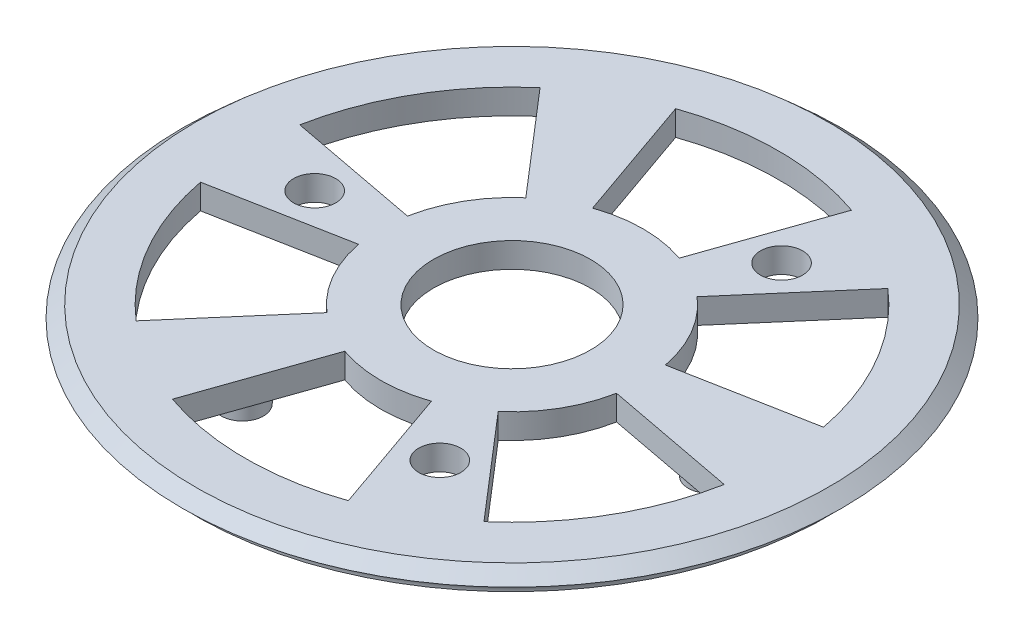
ISO-10303-21;
HEADER;
FILE_DESCRIPTION(('STEP AP214'),'2;1');
FILE_NAME('part.step','',(''),(''),'','','');
FILE_SCHEMA(('AUTOMOTIVE_DESIGN { 1 0 10303 214 1 1 1 1 }'));
ENDSEC;
DATA;
#1=APPLICATION_CONTEXT('core data for automotive mechanical design processes');
#2=APPLICATION_PROTOCOL_DEFINITION('international standard','automotive_design',2000,#1);
#3=PRODUCT_CONTEXT('',#1,'mechanical');
#4=PRODUCT('Part','Part','',(#3));
#5=PRODUCT_RELATED_PRODUCT_CATEGORY('part','',(#4));
#6=PRODUCT_DEFINITION_FORMATION('','',#4);
#7=PRODUCT_DEFINITION_CONTEXT('part definition',#1,'design');
#8=PRODUCT_DEFINITION('design','',#6,#7);
#9=PRODUCT_DEFINITION_SHAPE('','',#8);
#10=(LENGTH_UNIT() NAMED_UNIT(*) SI_UNIT(.MILLI.,.METRE.));
#11=(NAMED_UNIT(*) PLANE_ANGLE_UNIT() SI_UNIT($,.RADIAN.));
#12=(NAMED_UNIT(*) SI_UNIT($,.STERADIAN.) SOLID_ANGLE_UNIT());
#13=UNCERTAINTY_MEASURE_WITH_UNIT(LENGTH_MEASURE(1.E-05),#10,'distance_accuracy_value','');
#14=(GEOMETRIC_REPRESENTATION_CONTEXT(3) GLOBAL_UNCERTAINTY_ASSIGNED_CONTEXT((#13)) GLOBAL_UNIT_ASSIGNED_CONTEXT((#10,
#11,#12)) REPRESENTATION_CONTEXT('',''));
#15=CARTESIAN_POINT('',(0.,0.,0.));
#16=DIRECTION('',(0.,0.,1.));
#17=DIRECTION('',(1.,0.,0.));
#18=AXIS2_PLACEMENT_3D('',#15,#16,#17);
#19=CARTESIAN_POINT('',(-35.1,18.9164792308295,0.));
#20=DIRECTION('',(0.,1.,0.));
#21=DIRECTION('',(-1.,0.,0.));
#22=AXIS2_PLACEMENT_3D('',#19,#20,#21);
#23=CYLINDRICAL_SURFACE('',#22,32.1);
#24=DIRECTION('',(0.,1.,0.));
#25=VECTOR('',#24,1.);
#26=CARTESIAN_POINT('',(-66.6384220526739,-88.2865653815752,5.97812131253724));
#27=LINE('',#26,#25);
#28=CARTESIAN_POINT('',(-66.6384220526739,0.,5.97812131253724));
#29=VERTEX_POINT('',#28);
#30=CARTESIAN_POINT('',(-66.6384220526739,2.99999999999999,5.97812131253724));
#31=VERTEX_POINT('',#30);
#32=EDGE_CURVE('E210',#29,#31,#27,.T.);
#33=ORIENTED_EDGE('',*,*,#32,.T.);
#34=CARTESIAN_POINT('',(-35.1,2.99999999999999,0.));
#35=DIRECTION('',(0.,1.,0.));
#36=DIRECTION('',(-1.,0.,0.));
#37=AXIS2_PLACEMENT_3D('',#34,#35,#36);
#38=CIRCLE('',#37,32.1);
#39=CARTESIAN_POINT('',(-56.0464159498979,2.99999999999999,24.3240140366237));
#40=VERTEX_POINT('',#39);
#41=EDGE_CURVE('E226',#31,#40,#38,.T.);
#42=ORIENTED_EDGE('',*,*,#41,.T.);
#43=DIRECTION('',(0.,1.,0.));
#44=VECTOR('',#43,1.);
#45=CARTESIAN_POINT('',(-56.0464159498979,-88.2865653815752,24.3240140366237));
#46=LINE('',#45,#44);
#47=CARTESIAN_POINT('',(-56.0464159498979,0.,24.3240140366237));
#48=VERTEX_POINT('',#47);
#49=EDGE_CURVE('E289',#48,#40,#46,.T.);
#50=ORIENTED_EDGE('',*,*,#49,.F.);
#51=CARTESIAN_POINT('',(-35.1,0.,0.));
#52=DIRECTION('',(0.,1.,0.));
#53=DIRECTION('',(-1.,0.,0.));
#54=AXIS2_PLACEMENT_3D('',#51,#52,#53);
#55=CIRCLE('',#54,32.1);
#56=EDGE_CURVE('E228',#29,#48,#55,.T.);
#57=ORIENTED_EDGE('',*,*,#56,.F.);
#58=EDGE_LOOP('',(#33,#42,#50,#57));
#59=FACE_BOUND('',#58,.T.);
#60=ADVANCED_FACE('F41',(#59),#23,.F.);
#61=DIRECTION('',(0.,1.,0.));
#62=VECTOR('',#61,1.);
#63=CARTESIAN_POINT('',(-45.6920061027745,-88.2865653815752,30.3021353491596));
#64=LINE('',#63,#62);
#65=CARTESIAN_POINT('',(-45.6920061027745,0.,30.3021353491596));
#66=VERTEX_POINT('',#65);
#67=CARTESIAN_POINT('',(-45.6920061027745,2.99999999999999,30.3021353491596));
#68=VERTEX_POINT('',#67);
#69=EDGE_CURVE('E292',#66,#68,#64,.T.);
#70=ORIENTED_EDGE('',*,*,#69,.T.);
#71=CARTESIAN_POINT('',(-24.5079938972236,3.,30.3021353491588));
#72=VERTEX_POINT('',#71);
#73=EDGE_CURVE('E238',#68,#72,#38,.T.);
#74=ORIENTED_EDGE('',*,*,#73,.T.);
#75=DIRECTION('',(0.,1.,0.));
#76=VECTOR('',#75,1.);
#77=CARTESIAN_POINT('',(-24.5079938972236,-88.2865653815752,30.3021353491588));
#78=LINE('',#77,#76);
#79=CARTESIAN_POINT('',(-24.5079938972236,0.,30.3021353491588));
#80=VERTEX_POINT('',#79);
#81=EDGE_CURVE('E302',#80,#72,#78,.T.);
#82=ORIENTED_EDGE('',*,*,#81,.F.);
#83=EDGE_CURVE('E258',#66,#80,#55,.T.);
#84=ORIENTED_EDGE('',*,*,#83,.F.);
#85=EDGE_LOOP('',(#70,#74,#82,#84));
#86=FACE_BOUND('',#85,.T.);
#87=ADVANCED_FACE('F551',(#86),#23,.F.);
#88=DIRECTION('',(0.,1.,0.));
#89=VECTOR('',#88,1.);
#90=CARTESIAN_POINT('',(-14.1535840501007,-88.2865653815752,24.3240140366222));
#91=LINE('',#90,#89);
#92=CARTESIAN_POINT('',(-14.1535840501006,0.,24.3240140366223));
#93=VERTEX_POINT('',#92);
#94=CARTESIAN_POINT('',(-14.1535840501007,3.,24.3240140366222));
#95=VERTEX_POINT('',#94);
#96=EDGE_CURVE('E305',#93,#95,#91,.T.);
#97=ORIENTED_EDGE('',*,*,#96,.T.);
#98=CARTESIAN_POINT('',(-3.56157794732571,3.,5.97812131253529));
#99=VERTEX_POINT('',#98);
#100=EDGE_CURVE('E246',#95,#99,#38,.T.);
#101=ORIENTED_EDGE('',*,*,#100,.T.);
#102=DIRECTION('',(0.,1.,0.));
#103=VECTOR('',#102,1.);
#104=CARTESIAN_POINT('',(-3.56157794732569,-88.2865653815752,5.97812131253529));
#105=LINE('',#104,#103);
#106=CARTESIAN_POINT('',(-3.56157794732569,0.,5.9781213125353));
#107=VERTEX_POINT('',#106);
#108=EDGE_CURVE('E315',#107,#99,#105,.T.);
#109=ORIENTED_EDGE('',*,*,#108,.F.);
#110=EDGE_CURVE('E263',#93,#107,#55,.T.);
#111=ORIENTED_EDGE('',*,*,#110,.F.);
#112=EDGE_LOOP('',(#97,#101,#109,#111));
#113=FACE_BOUND('',#112,.T.);
#114=ADVANCED_FACE('F555',(#113),#23,.F.);
#115=DIRECTION('',(0.,1.,0.));
#116=VECTOR('',#115,1.);
#117=CARTESIAN_POINT('',(-3.56157794732606,-88.2865653815752,-5.97812131253724));
#118=LINE('',#117,#116);
#119=CARTESIAN_POINT('',(-3.56157794732609,0.,-5.97812131253724));
#120=VERTEX_POINT('',#119);
#121=CARTESIAN_POINT('',(-3.56157794732608,3.,-5.97812131253724));
#122=VERTEX_POINT('',#121);
#123=EDGE_CURVE('E318',#120,#122,#118,.T.);
#124=ORIENTED_EDGE('',*,*,#123,.T.);
#125=CARTESIAN_POINT('',(-14.1535840501021,3.,-24.3240140366236));
#126=VERTEX_POINT('',#125);
#127=EDGE_CURVE('E257',#122,#126,#38,.T.);
#128=ORIENTED_EDGE('',*,*,#127,.T.);
#129=DIRECTION('',(0.,1.,0.));
#130=VECTOR('',#129,1.);
#131=CARTESIAN_POINT('',(-14.1535840501021,-88.2865653815752,-24.3240140366236));
#132=LINE('',#131,#130);
#133=CARTESIAN_POINT('',(-14.1535840501021,0.,-24.3240140366236));
#134=VERTEX_POINT('',#133);
#135=EDGE_CURVE('E328',#134,#126,#132,.T.);
#136=ORIENTED_EDGE('',*,*,#135,.F.);
#137=EDGE_CURVE('E274',#120,#134,#55,.T.);
#138=ORIENTED_EDGE('',*,*,#137,.F.);
#139=EDGE_LOOP('',(#124,#128,#136,#138));
#140=FACE_BOUND('',#139,.T.);
#141=ADVANCED_FACE('F547',(#140),#23,.F.);
#142=DIRECTION('',(0.,1.,0.));
#143=VECTOR('',#142,1.);
#144=CARTESIAN_POINT('',(-24.5079938972254,-88.2865653815752,-30.3021353491596));
#145=LINE('',#144,#143);
#146=CARTESIAN_POINT('',(-24.5079938972255,0.,-30.3021353491596));
#147=VERTEX_POINT('',#146);
#148=CARTESIAN_POINT('',(-24.5079938972255,3.,-30.3021353491596));
#149=VERTEX_POINT('',#148);
#150=EDGE_CURVE('E67',#147,#149,#145,.T.);
#151=ORIENTED_EDGE('',*,*,#150,.T.);
#152=CARTESIAN_POINT('',(-45.6920061027764,2.99999999999999,-30.3021353491589));
#153=VERTEX_POINT('',#152);
#154=EDGE_CURVE('E250',#149,#153,#38,.T.);
#155=ORIENTED_EDGE('',*,*,#154,.T.);
#156=DIRECTION('',(0.,1.,0.));
#157=VECTOR('',#156,1.);
#158=CARTESIAN_POINT('',(-45.6920061027764,-88.2865653815752,-30.3021353491589));
#159=LINE('',#158,#157);
#160=CARTESIAN_POINT('',(-45.6920061027764,0.,-30.302135349159));
#161=VERTEX_POINT('',#160);
#162=EDGE_CURVE('E339',#161,#153,#159,.T.);
#163=ORIENTED_EDGE('',*,*,#162,.F.);
#164=EDGE_CURVE('E267',#147,#161,#55,.T.);
#165=ORIENTED_EDGE('',*,*,#164,.F.);
#166=EDGE_LOOP('',(#151,#155,#163,#165));
#167=FACE_BOUND('',#166,.T.);
#168=ADVANCED_FACE('F543',(#167),#23,.F.);
#169=CARTESIAN_POINT('',(-35.1,0.,0.));
#170=DIRECTION('',(0.,1.,0.));
#171=DIRECTION('',(-1.,0.,0.));
#172=AXIS2_PLACEMENT_3D('',#169,#170,#171);
#173=TOROIDAL_SURFACE('',#172,39.6875,1.5875);
#174=CARTESIAN_POINT('',(-35.1,0.,0.));
#175=DIRECTION('',(0.,1.,0.));
#176=DIRECTION('',(-1.,0.,0.));
#177=AXIS2_PLACEMENT_3D('',#174,#175,#176);
#178=CIRCLE('',#177,38.1);
#179=CARTESIAN_POINT('',(-73.2,0.,0.));
#180=VERTEX_POINT('',#179);
#181=EDGE_CURVE('E268',#180,#180,#178,.T.);
#182=ORIENTED_EDGE('',*,*,#181,.T.);
#183=EDGE_LOOP('',(#182));
#184=FACE_BOUND('',#183,.T.);
#185=CARTESIAN_POINT('',(-35.1,1.5875,0.));
#186=DIRECTION('',(0.,1.,0.));
#187=DIRECTION('',(-1.,0.,0.));
#188=AXIS2_PLACEMENT_3D('',#185,#186,#187);
#189=CIRCLE('',#188,39.6875);
#190=CARTESIAN_POINT('',(-74.7875,1.58749999999999,0.));
#191=VERTEX_POINT('',#190);
#192=EDGE_CURVE('E11',#191,#191,#189,.T.);
#193=ORIENTED_EDGE('',*,*,#192,.F.);
#194=EDGE_LOOP('',(#193));
#195=FACE_BOUND('',#194,.T.);
#196=ADVANCED_FACE('F43',(#184,#195),#173,.F.);
#197=CARTESIAN_POINT('',(-35.1,1.5875,0.));
#198=DIRECTION('',(0.,-1.,0.));
#199=DIRECTION('',(1.,0.,0.));
#200=AXIS2_PLACEMENT_3D('',#197,#198,#199);
#201=CONICAL_SURFACE('',#200,39.6875,0.843665466366982);
#202=CARTESIAN_POINT('',(-35.1,2.99999999999999,0.));
#203=DIRECTION('',(0.,1.,0.));
#204=DIRECTION('',(-1.,0.,0.));
#205=AXIS2_PLACEMENT_3D('',#202,#203,#204);
#206=CIRCLE('',#205,38.1);
#207=CARTESIAN_POINT('',(-73.2,2.99999999999998,0.));
#208=VERTEX_POINT('',#207);
#209=EDGE_CURVE('E51',#208,#208,#206,.T.);
#210=ORIENTED_EDGE('',*,*,#209,.F.);
#211=EDGE_LOOP('',(#210));
#212=FACE_BOUND('',#211,.T.);
#213=ORIENTED_EDGE('',*,*,#192,.T.);
#214=EDGE_LOOP('',(#213));
#215=FACE_BOUND('',#214,.T.);
#216=ADVANCED_FACE('F519',(#212,#215),#201,.T.);
#217=CARTESIAN_POINT('',(0.,3.,0.));
#218=DIRECTION('',(0.,1.,0.));
#219=DIRECTION('',(-1.,0.,0.));
#220=AXIS2_PLACEMENT_3D('',#217,#218,#219);
#221=PLANE('',#220);
#222=CARTESIAN_POINT('',(-23.2161625740322,3.,20.5834102106652));
#223=DIRECTION('',(0.,1.,0.));
#224=DIRECTION('',(-1.,0.,0.));
#225=AXIS2_PLACEMENT_3D('',#222,#223,#224);
#226=CIRCLE('',#225,2.54);
#227=CARTESIAN_POINT('',(-25.7561625740322,3.,20.5834102106652));
#228=VERTEX_POINT('',#227);
#229=EDGE_CURVE('E503',#228,#228,#226,.T.);
#230=ORIENTED_EDGE('',*,*,#229,.F.);
#231=EDGE_LOOP('',(#230));
#232=FACE_BOUND('',#231,.T.);
#233=CARTESIAN_POINT('',(-23.2161625740319,3.,-20.5834102106651));
#234=DIRECTION('',(0.,1.,0.));
#235=DIRECTION('',(-1.,0.,0.));
#236=AXIS2_PLACEMENT_3D('',#233,#234,#235);
#237=CIRCLE('',#236,2.54);
#238=CARTESIAN_POINT('',(-25.7561625740319,3.,-20.5834102106651));
#239=VERTEX_POINT('',#238);
#240=EDGE_CURVE('E494',#239,#239,#237,.T.);
#241=ORIENTED_EDGE('',*,*,#240,.F.);
#242=EDGE_LOOP('',(#241));
#243=FACE_BOUND('',#242,.T.);
#244=CARTESIAN_POINT('',(-58.867674851936,2.99999999999999,-3.43475248243408E-13));
#245=DIRECTION('',(0.,1.,0.));
#246=DIRECTION('',(-1.,0.,0.));
#247=AXIS2_PLACEMENT_3D('',#244,#245,#246);
#248=CIRCLE('',#247,2.54);
#249=CARTESIAN_POINT('',(-61.407674851936,2.99999999999999,-3.43475248243408E-13));
#250=VERTEX_POINT('',#249);
#251=EDGE_CURVE('E495',#250,#250,#248,.T.);
#252=ORIENTED_EDGE('',*,*,#251,.F.);
#253=EDGE_LOOP('',(#252));
#254=FACE_BOUND('',#253,.T.);
#255=ORIENTED_EDGE('',*,*,#73,.F.);
#256=DIRECTION('',(0.329969037469611,0.,-0.943991755425533));
#257=VECTOR('',#256,1.);
#258=CARTESIAN_POINT('',(-40.3172359800001,2.99999999999999,14.9257269378893));
#259=LINE('',#258,#257);
#260=CARTESIAN_POINT('',(-40.3172359800001,2.99999999999999,14.9257269378893));
#261=VERTEX_POINT('',#260);
#262=EDGE_CURVE('E409',#68,#261,#259,.T.);
#263=ORIENTED_EDGE('',*,*,#262,.T.);
#264=CARTESIAN_POINT('',(-35.1,2.99999999999999,0.));
#265=DIRECTION('',(0.,1.,0.));
#266=DIRECTION('',(-1.,0.,0.));
#267=AXIS2_PLACEMENT_3D('',#264,#265,#266);
#268=CIRCLE('',#267,15.8112895076727);
#269=CARTESIAN_POINT('',(-29.882764019999,2.99999999999999,14.9257269378889));
#270=VERTEX_POINT('',#269);
#271=EDGE_CURVE('E405',#261,#270,#268,.T.);
#272=ORIENTED_EDGE('',*,*,#271,.T.);
#273=DIRECTION('',(0.32996903746967,0.,0.943991755425512));
#274=VECTOR('',#273,1.);
#275=CARTESIAN_POINT('',(-29.882764019999,2.99999999999999,14.9257269378889));
#276=LINE('',#275,#274);
#277=EDGE_CURVE('E401',#270,#72,#276,.T.);
#278=ORIENTED_EDGE('',*,*,#277,.T.);
#279=EDGE_LOOP('',(#255,#263,#272,#278));
#280=FACE_BOUND('',#279,.T.);
#281=ORIENTED_EDGE('',*,*,#100,.F.);
#282=DIRECTION('',(-0.652536322426772,0.,-0.757757446623749));
#283=VECTOR('',#282,1.);
#284=CARTESIAN_POINT('',(-24.7825592918382,3.,11.9811223651629));
#285=LINE('',#284,#283);
#286=CARTESIAN_POINT('',(-24.7825592918382,3.,11.9811223651629));
#287=VERTEX_POINT('',#286);
#288=EDGE_CURVE('E397',#95,#287,#285,.T.);
#289=ORIENTED_EDGE('',*,*,#288,.T.);
#290=CARTESIAN_POINT('',(-35.1,2.99999999999999,0.));
#291=DIRECTION('',(0.,1.,0.));
#292=DIRECTION('',(-1.,0.,0.));
#293=AXIS2_PLACEMENT_3D('',#290,#291,#292);
#294=CIRCLE('',#293,15.8112895076727);
#295=CARTESIAN_POINT('',(-19.5653233118379,3.,2.94460457272535));
#296=VERTEX_POINT('',#295);
#297=EDGE_CURVE('E393',#287,#296,#294,.T.);
#298=ORIENTED_EDGE('',*,*,#297,.T.);
#299=DIRECTION('',(0.982505359896395,0.,0.186234308801723));
#300=VECTOR('',#299,1.);
#301=CARTESIAN_POINT('',(-19.5653233118379,3.,2.94460457272535));
#302=LINE('',#301,#300);
#303=EDGE_CURVE('E389',#296,#99,#302,.T.);
#304=ORIENTED_EDGE('',*,*,#303,.T.);
#305=EDGE_LOOP('',(#281,#289,#298,#304));
#306=FACE_BOUND('',#305,.T.);
#307=ORIENTED_EDGE('',*,*,#127,.F.);
#308=DIRECTION('',(-0.982505359896384,0.,0.186234308801783));
#309=VECTOR('',#308,1.);
#310=CARTESIAN_POINT('',(-19.5653233118381,3.,-2.94460457272631));
#311=LINE('',#310,#309);
#312=CARTESIAN_POINT('',(-19.5653233118381,3.,-2.94460457272631));
#313=VERTEX_POINT('',#312);
#314=EDGE_CURVE('E385',#122,#313,#311,.T.);
#315=ORIENTED_EDGE('',*,*,#314,.T.);
#316=CARTESIAN_POINT('',(-35.1,2.99999999999999,0.));
#317=DIRECTION('',(0.,1.,0.));
#318=DIRECTION('',(-1.,0.,0.));
#319=AXIS2_PLACEMENT_3D('',#316,#317,#318);
#320=CIRCLE('',#319,15.8112895076727);
#321=CARTESIAN_POINT('',(-24.782559291839,3.,-11.9811223651636));
#322=VERTEX_POINT('',#321);
#323=EDGE_CURVE('E381',#313,#322,#320,.T.);
#324=ORIENTED_EDGE('',*,*,#323,.T.);
#325=DIRECTION('',(0.652536322426726,0.,-0.757757446623789));
#326=VECTOR('',#325,1.);
#327=CARTESIAN_POINT('',(-24.782559291839,3.,-11.9811223651636));
#328=LINE('',#327,#326);
#329=EDGE_CURVE('E377',#322,#126,#328,.T.);
#330=ORIENTED_EDGE('',*,*,#329,.T.);
#331=EDGE_LOOP('',(#307,#315,#324,#330));
#332=FACE_BOUND('',#331,.T.);
#333=ORIENTED_EDGE('',*,*,#154,.F.);
#334=DIRECTION('',(-0.329969037469612,0.,0.943991755425532));
#335=VECTOR('',#334,1.);
#336=CARTESIAN_POINT('',(-29.8827640199999,2.99999999999999,-14.9257269378893));
#337=LINE('',#336,#335);
#338=CARTESIAN_POINT('',(-29.8827640199999,2.99999999999999,-14.9257269378893));
#339=VERTEX_POINT('',#338);
#340=EDGE_CURVE('E373',#149,#339,#337,.T.);
#341=ORIENTED_EDGE('',*,*,#340,.T.);
#342=CARTESIAN_POINT('',(-35.1,2.99999999999999,0.));
#343=DIRECTION('',(0.,1.,0.));
#344=DIRECTION('',(-1.,0.,0.));
#345=AXIS2_PLACEMENT_3D('',#342,#343,#344);
#346=CIRCLE('',#345,15.8112895076727);
#347=CARTESIAN_POINT('',(-40.317235980001,2.99999999999999,-14.9257269378889));
#348=VERTEX_POINT('',#347);
#349=EDGE_CURVE('E369',#339,#348,#346,.T.);
#350=ORIENTED_EDGE('',*,*,#349,.T.);
#351=DIRECTION('',(-0.329969037469669,0.,-0.943991755425512));
#352=VECTOR('',#351,1.);
#353=CARTESIAN_POINT('',(-40.317235980001,2.99999999999999,-14.9257269378889));
#354=LINE('',#353,#352);
#355=EDGE_CURVE('E365',#348,#153,#354,.T.);
#356=ORIENTED_EDGE('',*,*,#355,.T.);
#357=EDGE_LOOP('',(#333,#341,#350,#356));
#358=FACE_BOUND('',#357,.T.);
#359=CARTESIAN_POINT('',(-56.0464159498994,2.99999999999999,-24.3240140366224));
#360=VERTEX_POINT('',#359);
#361=CARTESIAN_POINT('',(-66.6384220526743,2.99999999999999,-5.97812131253532));
#362=VERTEX_POINT('',#361);
#363=EDGE_CURVE('E240',#360,#362,#38,.T.);
#364=ORIENTED_EDGE('',*,*,#363,.F.);
#365=DIRECTION('',(0.652536322426772,0.,0.757757446623749));
#366=VECTOR('',#365,1.);
#367=CARTESIAN_POINT('',(-45.4174407081618,2.99999999999999,-11.9811223651629));
#368=LINE('',#367,#366);
#369=CARTESIAN_POINT('',(-45.4174407081617,2.99999999999999,-11.9811223651629));
#370=VERTEX_POINT('',#369);
#371=EDGE_CURVE('E361',#360,#370,#368,.T.);
#372=ORIENTED_EDGE('',*,*,#371,.T.);
#373=CARTESIAN_POINT('',(-35.1,2.99999999999999,0.));
#374=DIRECTION('',(0.,1.,0.));
#375=DIRECTION('',(-1.,0.,0.));
#376=AXIS2_PLACEMENT_3D('',#373,#374,#375);
#377=CIRCLE('',#376,15.8112895076727);
#378=CARTESIAN_POINT('',(-50.6346766881621,2.99999999999999,-2.94460457272536));
#379=VERTEX_POINT('',#378);
#380=EDGE_CURVE('E357',#370,#379,#377,.T.);
#381=ORIENTED_EDGE('',*,*,#380,.T.);
#382=DIRECTION('',(-0.982505359896395,0.,-0.186234308801723));
#383=VECTOR('',#382,1.);
#384=CARTESIAN_POINT('',(-50.6346766881621,2.99999999999999,-2.94460457272536));
#385=LINE('',#384,#383);
#386=EDGE_CURVE('E230',#379,#362,#385,.T.);
#387=ORIENTED_EDGE('',*,*,#386,.T.);
#388=EDGE_LOOP('',(#364,#372,#381,#387));
#389=FACE_BOUND('',#388,.T.);
#390=ORIENTED_EDGE('',*,*,#209,.T.);
#391=EDGE_LOOP('',(#390));
#392=FACE_BOUND('',#391,.T.);
#393=ORIENTED_EDGE('',*,*,#41,.F.);
#394=DIRECTION('',(0.982505359896384,0.,-0.186234308801783));
#395=VECTOR('',#394,1.);
#396=CARTESIAN_POINT('',(-50.6346766881619,2.99999999999999,2.94460457272631));
#397=LINE('',#396,#395);
#398=CARTESIAN_POINT('',(-50.6346766881619,2.99999999999999,2.94460457272631));
#399=VERTEX_POINT('',#398);
#400=EDGE_CURVE('E206',#31,#399,#397,.T.);
#401=ORIENTED_EDGE('',*,*,#400,.T.);
#402=CARTESIAN_POINT('',(-35.1,2.99999999999999,0.));
#403=DIRECTION('',(0.,1.,0.));
#404=DIRECTION('',(-1.,0.,0.));
#405=AXIS2_PLACEMENT_3D('',#402,#403,#404);
#406=CIRCLE('',#405,15.8112895076727);
#407=CARTESIAN_POINT('',(-45.417440708161,2.99999999999999,11.9811223651636));
#408=VERTEX_POINT('',#407);
#409=EDGE_CURVE('E219',#399,#408,#406,.T.);
#410=ORIENTED_EDGE('',*,*,#409,.T.);
#411=DIRECTION('',(-0.652536322426725,0.,0.757757446623789));
#412=VECTOR('',#411,1.);
#413=CARTESIAN_POINT('',(-45.417440708161,2.99999999999999,11.9811223651636));
#414=LINE('',#413,#412);
#415=EDGE_CURVE('E236',#408,#40,#414,.T.);
#416=ORIENTED_EDGE('',*,*,#415,.T.);
#417=EDGE_LOOP('',(#393,#401,#410,#416));
#418=FACE_BOUND('',#417,.T.);
#419=CARTESIAN_POINT('',(-35.1,2.99999999999999,0.));
#420=DIRECTION('',(0.,1.,0.));
#421=DIRECTION('',(-1.,0.,0.));
#422=AXIS2_PLACEMENT_3D('',#419,#420,#421);
#423=CIRCLE('',#422,9.4612895076727);
#424=CARTESIAN_POINT('',(-44.5612895076727,2.99999999999999,0.));
#425=VERTEX_POINT('',#424);
#426=EDGE_CURVE('E220',#425,#425,#423,.T.);
#427=ORIENTED_EDGE('',*,*,#426,.F.);
#428=EDGE_LOOP('',(#427));
#429=FACE_BOUND('',#428,.T.);
#430=ADVANCED_FACE('F233',(#232,#243,#254,#280,#306,#332,#358,#389,#392,#418,#429),#221,.T.);
#431=DIRECTION('',(0.,1.,0.));
#432=VECTOR('',#431,1.);
#433=CARTESIAN_POINT('',(-56.0464159498994,-88.2865653815752,-24.3240140366224));
#434=LINE('',#433,#432);
#435=CARTESIAN_POINT('',(-56.0464159498994,0.,-24.3240140366224));
#436=VERTEX_POINT('',#435);
#437=EDGE_CURVE('E59',#436,#360,#434,.T.);
#438=ORIENTED_EDGE('',*,*,#437,.T.);
#439=ORIENTED_EDGE('',*,*,#363,.T.);
#440=DIRECTION('',(0.,1.,0.));
#441=VECTOR('',#440,1.);
#442=CARTESIAN_POINT('',(-66.6384220526743,-88.2865653815752,-5.97812131253532));
#443=LINE('',#442,#441);
#444=CARTESIAN_POINT('',(-66.6384220526743,0.,-5.97812131253532));
#445=VERTEX_POINT('',#444);
#446=EDGE_CURVE('E350',#445,#362,#443,.T.);
#447=ORIENTED_EDGE('',*,*,#446,.F.);
#448=EDGE_CURVE('E259',#436,#445,#55,.T.);
#449=ORIENTED_EDGE('',*,*,#448,.F.);
#450=EDGE_LOOP('',(#438,#439,#447,#449));
#451=FACE_BOUND('',#450,.T.);
#452=ADVANCED_FACE('F518',(#451),#23,.F.);
#453=CARTESIAN_POINT('',(0.,0.,0.));
#454=DIRECTION('',(0.,1.,0.));
#455=DIRECTION('',(-1.,0.,0.));
#456=AXIS2_PLACEMENT_3D('',#453,#454,#455);
#457=PLANE('',#456);
#458=CARTESIAN_POINT('',(-23.2161625740322,0.,20.5834102106652));
#459=DIRECTION('',(0.,1.,0.));
#460=DIRECTION('',(-1.,0.,0.));
#461=AXIS2_PLACEMENT_3D('',#458,#459,#460);
#462=CIRCLE('',#461,2.54);
#463=CARTESIAN_POINT('',(-25.7561625740322,0.,20.5834102106652));
#464=VERTEX_POINT('',#463);
#465=EDGE_CURVE('E489',#464,#464,#462,.F.);
#466=ORIENTED_EDGE('',*,*,#465,.F.);
#467=EDGE_LOOP('',(#466));
#468=FACE_BOUND('',#467,.T.);
#469=CARTESIAN_POINT('',(-23.2161625740319,0.,-20.5834102106651));
#470=DIRECTION('',(0.,1.,0.));
#471=DIRECTION('',(-1.,0.,0.));
#472=AXIS2_PLACEMENT_3D('',#469,#470,#471);
#473=CIRCLE('',#472,2.54);
#474=CARTESIAN_POINT('',(-25.7561625740319,0.,-20.5834102106651));
#475=VERTEX_POINT('',#474);
#476=EDGE_CURVE('E499',#475,#475,#473,.F.);
#477=ORIENTED_EDGE('',*,*,#476,.F.);
#478=EDGE_LOOP('',(#477));
#479=FACE_BOUND('',#478,.T.);
#480=CARTESIAN_POINT('',(-58.867674851936,0.,-3.43475248243408E-13));
#481=DIRECTION('',(0.,1.,0.));
#482=DIRECTION('',(-1.,0.,0.));
#483=AXIS2_PLACEMENT_3D('',#480,#481,#482);
#484=CIRCLE('',#483,2.54);
#485=CARTESIAN_POINT('',(-61.407674851936,0.,-3.43475248243408E-13));
#486=VERTEX_POINT('',#485);
#487=EDGE_CURVE('E490',#486,#486,#484,.F.);
#488=ORIENTED_EDGE('',*,*,#487,.F.);
#489=EDGE_LOOP('',(#488));
#490=FACE_BOUND('',#489,.T.);
#491=CARTESIAN_POINT('',(-46.9838374259682,0.,20.583410210665));
#492=DIRECTION('',(0.,1.,0.));
#493=DIRECTION('',(-1.,0.,0.));
#494=AXIS2_PLACEMENT_3D('',#491,#492,#493);
#495=CIRCLE('',#494,2.54);
#496=CARTESIAN_POINT('',(-49.5238374259682,0.,20.583410210665));
#497=VERTEX_POINT('',#496);
#498=EDGE_CURVE('E45',#497,#497,#495,.T.);
#499=ORIENTED_EDGE('',*,*,#498,.T.);
#500=EDGE_LOOP('',(#499));
#501=FACE_BOUND('',#500,.T.);
#502=CARTESIAN_POINT('',(-11.332325148064,0.,1.65968786426451E-13));
#503=DIRECTION('',(0.,1.,0.));
#504=DIRECTION('',(-1.,0.,0.));
#505=AXIS2_PLACEMENT_3D('',#502,#503,#504);
#506=CIRCLE('',#505,2.54);
#507=CARTESIAN_POINT('',(-13.872325148064,0.,1.65968786426451E-13));
#508=VERTEX_POINT('',#507);
#509=EDGE_CURVE('E480',#508,#508,#506,.T.);
#510=ORIENTED_EDGE('',*,*,#509,.T.);
#511=EDGE_LOOP('',(#510));
#512=FACE_BOUND('',#511,.T.);
#513=CARTESIAN_POINT('',(-46.983837425968,0.,-20.5834102106652));
#514=DIRECTION('',(0.,1.,0.));
#515=DIRECTION('',(-1.,0.,0.));
#516=AXIS2_PLACEMENT_3D('',#513,#514,#515);
#517=CIRCLE('',#516,2.54);
#518=CARTESIAN_POINT('',(-49.523837425968,0.,-20.5834102106652));
#519=VERTEX_POINT('',#518);
#520=EDGE_CURVE('E420',#519,#519,#517,.T.);
#521=ORIENTED_EDGE('',*,*,#520,.T.);
#522=EDGE_LOOP('',(#521));
#523=FACE_BOUND('',#522,.T.);
#524=ORIENTED_EDGE('',*,*,#56,.T.);
#525=DIRECTION('',(0.652536322426725,0.,-0.757757446623789));
#526=VECTOR('',#525,1.);
#527=CARTESIAN_POINT('',(-45.417440708161,0.,11.9811223651636));
#528=LINE('',#527,#526);
#529=CARTESIAN_POINT('',(-45.417440708161,0.,11.9811223651636));
#530=VERTEX_POINT('',#529);
#531=EDGE_CURVE('E469',#48,#530,#528,.T.);
#532=ORIENTED_EDGE('',*,*,#531,.T.);
#533=CARTESIAN_POINT('',(-35.1,0.,0.));
#534=DIRECTION('',(0.,1.,0.));
#535=DIRECTION('',(-1.,0.,0.));
#536=AXIS2_PLACEMENT_3D('',#533,#534,#535);
#537=CIRCLE('',#536,15.8112895076727);
#538=CARTESIAN_POINT('',(-50.6346766881619,0.,2.94460457272631));
#539=VERTEX_POINT('',#538);
#540=EDGE_CURVE('E353',#530,#539,#537,.F.);
#541=ORIENTED_EDGE('',*,*,#540,.T.);
#542=DIRECTION('',(-0.982505359896384,0.,0.186234308801783));
#543=VECTOR('',#542,1.);
#544=CARTESIAN_POINT('',(-50.6346766881619,0.,2.94460457272631));
#545=LINE('',#544,#543);
#546=EDGE_CURVE('E281',#539,#29,#545,.T.);
#547=ORIENTED_EDGE('',*,*,#546,.T.);
#548=EDGE_LOOP('',(#524,#532,#541,#547));
#549=FACE_BOUND('',#548,.T.);
#550=ORIENTED_EDGE('',*,*,#83,.T.);
#551=DIRECTION('',(-0.32996903746967,0.,-0.943991755425512));
#552=VECTOR('',#551,1.);
#553=CARTESIAN_POINT('',(-29.882764019999,0.,14.9257269378889));
#554=LINE('',#553,#552);
#555=CARTESIAN_POINT('',(-29.8827640199989,0.,14.9257269378889));
#556=VERTEX_POINT('',#555);
#557=EDGE_CURVE('E459',#80,#556,#554,.T.);
#558=ORIENTED_EDGE('',*,*,#557,.T.);
#559=CARTESIAN_POINT('',(-35.1,0.,0.));
#560=DIRECTION('',(0.,1.,0.));
#561=DIRECTION('',(-1.,0.,0.));
#562=AXIS2_PLACEMENT_3D('',#559,#560,#561);
#563=CIRCLE('',#562,15.8112895076727);
#564=CARTESIAN_POINT('',(-40.3172359800001,0.,14.9257269378893));
#565=VERTEX_POINT('',#564);
#566=EDGE_CURVE('E462',#556,#565,#563,.F.);
#567=ORIENTED_EDGE('',*,*,#566,.T.);
#568=DIRECTION('',(-0.329969037469611,0.,0.943991755425533));
#569=VECTOR('',#568,1.);
#570=CARTESIAN_POINT('',(-40.3172359800001,0.,14.9257269378893));
#571=LINE('',#570,#569);
#572=EDGE_CURVE('E465',#565,#66,#571,.T.);
#573=ORIENTED_EDGE('',*,*,#572,.T.);
#574=EDGE_LOOP('',(#550,#558,#567,#573));
#575=FACE_BOUND('',#574,.T.);
#576=ORIENTED_EDGE('',*,*,#110,.T.);
#577=DIRECTION('',(-0.982505359896395,0.,-0.186234308801723));
#578=VECTOR('',#577,1.);
#579=CARTESIAN_POINT('',(-19.5653233118379,0.,2.94460457272535));
#580=LINE('',#579,#578);
#581=CARTESIAN_POINT('',(-19.5653233118379,0.,2.94460457272535));
#582=VERTEX_POINT('',#581);
#583=EDGE_CURVE('E449',#107,#582,#580,.T.);
#584=ORIENTED_EDGE('',*,*,#583,.T.);
#585=CARTESIAN_POINT('',(-35.1,0.,0.));
#586=DIRECTION('',(0.,1.,0.));
#587=DIRECTION('',(-1.,0.,0.));
#588=AXIS2_PLACEMENT_3D('',#585,#586,#587);
#589=CIRCLE('',#588,15.8112895076727);
#590=CARTESIAN_POINT('',(-24.7825592918382,0.,11.9811223651629));
#591=VERTEX_POINT('',#590);
#592=EDGE_CURVE('E452',#582,#591,#589,.F.);
#593=ORIENTED_EDGE('',*,*,#592,.T.);
#594=DIRECTION('',(0.652536322426772,0.,0.757757446623749));
#595=VECTOR('',#594,1.);
#596=CARTESIAN_POINT('',(-24.7825592918382,0.,11.9811223651629));
#597=LINE('',#596,#595);
#598=EDGE_CURVE('E455',#591,#93,#597,.T.);
#599=ORIENTED_EDGE('',*,*,#598,.T.);
#600=EDGE_LOOP('',(#576,#584,#593,#599));
#601=FACE_BOUND('',#600,.T.);
#602=ORIENTED_EDGE('',*,*,#137,.T.);
#603=DIRECTION('',(-0.652536322426726,0.,0.757757446623789));
#604=VECTOR('',#603,1.);
#605=CARTESIAN_POINT('',(-24.782559291839,0.,-11.9811223651636));
#606=LINE('',#605,#604);
#607=CARTESIAN_POINT('',(-24.782559291839,0.,-11.9811223651636));
#608=VERTEX_POINT('',#607);
#609=EDGE_CURVE('E439',#134,#608,#606,.T.);
#610=ORIENTED_EDGE('',*,*,#609,.T.);
#611=CARTESIAN_POINT('',(-35.1,0.,0.));
#612=DIRECTION('',(0.,1.,0.));
#613=DIRECTION('',(-1.,0.,0.));
#614=AXIS2_PLACEMENT_3D('',#611,#612,#613);
#615=CIRCLE('',#614,15.8112895076727);
#616=CARTESIAN_POINT('',(-19.5653233118381,0.,-2.94460457272631));
#617=VERTEX_POINT('',#616);
#618=EDGE_CURVE('E442',#608,#617,#615,.F.);
#619=ORIENTED_EDGE('',*,*,#618,.T.);
#620=DIRECTION('',(0.982505359896384,0.,-0.186234308801783));
#621=VECTOR('',#620,1.);
#622=CARTESIAN_POINT('',(-19.5653233118381,0.,-2.94460457272631));
#623=LINE('',#622,#621);
#624=EDGE_CURVE('E445',#617,#120,#623,.T.);
#625=ORIENTED_EDGE('',*,*,#624,.T.);
#626=EDGE_LOOP('',(#602,#610,#619,#625));
#627=FACE_BOUND('',#626,.T.);
#628=ORIENTED_EDGE('',*,*,#164,.T.);
#629=DIRECTION('',(0.32996903746967,0.,0.943991755425512));
#630=VECTOR('',#629,1.);
#631=CARTESIAN_POINT('',(-40.317235980001,0.,-14.9257269378889));
#632=LINE('',#631,#630);
#633=CARTESIAN_POINT('',(-40.317235980001,0.,-14.9257269378889));
#634=VERTEX_POINT('',#633);
#635=EDGE_CURVE('E430',#161,#634,#632,.T.);
#636=ORIENTED_EDGE('',*,*,#635,.T.);
#637=CARTESIAN_POINT('',(-35.1,0.,0.));
#638=DIRECTION('',(0.,1.,0.));
#639=DIRECTION('',(-1.,0.,0.));
#640=AXIS2_PLACEMENT_3D('',#637,#638,#639);
#641=CIRCLE('',#640,15.8112895076727);
#642=CARTESIAN_POINT('',(-29.8827640199999,0.,-14.9257269378893));
#643=VERTEX_POINT('',#642);
#644=EDGE_CURVE('E433',#634,#643,#641,.F.);
#645=ORIENTED_EDGE('',*,*,#644,.T.);
#646=DIRECTION('',(0.329969037469612,0.,-0.943991755425532));
#647=VECTOR('',#646,1.);
#648=CARTESIAN_POINT('',(-29.8827640199999,0.,-14.9257269378893));
#649=LINE('',#648,#647);
#650=EDGE_CURVE('E436',#643,#147,#649,.T.);
#651=ORIENTED_EDGE('',*,*,#650,.T.);
#652=EDGE_LOOP('',(#628,#636,#645,#651));
#653=FACE_BOUND('',#652,.T.);
#654=ORIENTED_EDGE('',*,*,#181,.F.);
#655=EDGE_LOOP('',(#654));
#656=FACE_BOUND('',#655,.T.);
#657=DIRECTION('',(-0.652536322426772,0.,-0.757757446623749));
#658=VECTOR('',#657,1.);
#659=CARTESIAN_POINT('',(-45.4174407081617,0.,-11.9811223651629));
#660=LINE('',#659,#658);
#661=CARTESIAN_POINT('',(-45.4174407081618,0.,-11.9811223651629));
#662=VERTEX_POINT('',#661);
#663=EDGE_CURVE('E427',#662,#436,#660,.T.);
#664=ORIENTED_EDGE('',*,*,#663,.T.);
#665=ORIENTED_EDGE('',*,*,#448,.T.);
#666=DIRECTION('',(0.982505359896395,0.,0.186234308801723));
#667=VECTOR('',#666,1.);
#668=CARTESIAN_POINT('',(-50.6346766881621,0.,-2.94460457272536));
#669=LINE('',#668,#667);
#670=CARTESIAN_POINT('',(-50.6346766881621,0.,-2.94460457272536));
#671=VERTEX_POINT('',#670);
#672=EDGE_CURVE('E421',#445,#671,#669,.T.);
#673=ORIENTED_EDGE('',*,*,#672,.T.);
#674=CARTESIAN_POINT('',(-35.1,0.,0.));
#675=DIRECTION('',(0.,1.,0.));
#676=DIRECTION('',(-1.,0.,0.));
#677=AXIS2_PLACEMENT_3D('',#674,#675,#676);
#678=CIRCLE('',#677,15.8112895076727);
#679=EDGE_CURVE('E424',#671,#662,#678,.F.);
#680=ORIENTED_EDGE('',*,*,#679,.T.);
#681=EDGE_LOOP('',(#664,#665,#673,#680));
#682=FACE_BOUND('',#681,.T.);
#683=CARTESIAN_POINT('',(-35.1,0.,0.));
#684=DIRECTION('',(0.,1.,0.));
#685=DIRECTION('',(-1.,0.,0.));
#686=AXIS2_PLACEMENT_3D('',#683,#684,#685);
#687=CIRCLE('',#686,9.4612895076727);
#688=CARTESIAN_POINT('',(-44.5612895076727,0.,0.));
#689=VERTEX_POINT('',#688);
#690=EDGE_CURVE('E276',#689,#689,#687,.F.);
#691=ORIENTED_EDGE('',*,*,#690,.F.);
#692=EDGE_LOOP('',(#691));
#693=FACE_BOUND('',#692,.T.);
#694=ADVANCED_FACE('F559',(#468,#479,#490,#501,#512,#523,#549,#575,#601,#627,#653,#656,#682,
#693),#457,.F.);
#695=CARTESIAN_POINT('',(-50.6346766881619,-88.2865653815752,2.94460457272631));
#696=DIRECTION('',(0.186234308801783,0.,0.982505359896384));
#697=DIRECTION('',(0.982505359896384,0.,-0.186234308801783));
#698=AXIS2_PLACEMENT_3D('',#695,#696,#697);
#699=PLANE('',#698);
#700=ORIENTED_EDGE('',*,*,#546,.F.);
#701=DIRECTION('',(0.,1.,0.));
#702=VECTOR('',#701,1.);
#703=CARTESIAN_POINT('',(-50.6346766881619,-88.2865653815752,2.94460457272631));
#704=LINE('',#703,#702);
#705=EDGE_CURVE('E213',#539,#399,#704,.T.);
#706=ORIENTED_EDGE('',*,*,#705,.T.);
#707=ORIENTED_EDGE('',*,*,#400,.F.);
#708=ORIENTED_EDGE('',*,*,#32,.F.);
#709=EDGE_LOOP('',(#700,#706,#707,#708));
#710=FACE_BOUND('',#709,.T.);
#711=ADVANCED_FACE('F209',(#710),#699,.T.);
#712=CARTESIAN_POINT('',(-35.1,-88.2865653815752,0.));
#713=DIRECTION('',(0.,1.,0.));
#714=DIRECTION('',(-1.,0.,0.));
#715=AXIS2_PLACEMENT_3D('',#712,#713,#714);
#716=CYLINDRICAL_SURFACE('',#715,15.8112895076727);
#717=ORIENTED_EDGE('',*,*,#540,.F.);
#718=DIRECTION('',(0.,1.,0.));
#719=VECTOR('',#718,1.);
#720=CARTESIAN_POINT('',(-45.417440708161,-88.2865653815752,11.9811223651636));
#721=LINE('',#720,#719);
#722=EDGE_CURVE('E286',#530,#408,#721,.T.);
#723=ORIENTED_EDGE('',*,*,#722,.T.);
#724=ORIENTED_EDGE('',*,*,#409,.F.);
#725=ORIENTED_EDGE('',*,*,#705,.F.);
#726=EDGE_LOOP('',(#717,#723,#724,#725));
#727=FACE_BOUND('',#726,.T.);
#728=ADVANCED_FACE('F633',(#727),#716,.T.);
#729=CARTESIAN_POINT('',(-45.417440708161,-88.2865653815752,11.9811223651636));
#730=DIRECTION('',(-0.757757446623789,0.,-0.652536322426725));
#731=DIRECTION('',(-0.652536322426725,0.,0.757757446623789));
#732=AXIS2_PLACEMENT_3D('',#729,#730,#731);
#733=PLANE('',#732);
#734=ORIENTED_EDGE('',*,*,#531,.F.);
#735=ORIENTED_EDGE('',*,*,#49,.T.);
#736=ORIENTED_EDGE('',*,*,#415,.F.);
#737=ORIENTED_EDGE('',*,*,#722,.F.);
#738=EDGE_LOOP('',(#734,#735,#736,#737));
#739=FACE_BOUND('',#738,.T.);
#740=ADVANCED_FACE('F629',(#739),#733,.T.);
#741=CARTESIAN_POINT('',(-40.3172359800001,-88.2865653815752,14.9257269378893));
#742=DIRECTION('',(0.943991755425533,0.,0.329969037469611));
#743=DIRECTION('',(0.329969037469611,0.,-0.943991755425533));
#744=AXIS2_PLACEMENT_3D('',#741,#742,#743);
#745=PLANE('',#744);
#746=ORIENTED_EDGE('',*,*,#572,.F.);
#747=DIRECTION('',(0.,1.,0.));
#748=VECTOR('',#747,1.);
#749=CARTESIAN_POINT('',(-40.3172359800001,-88.2865653815752,14.9257269378893));
#750=LINE('',#749,#748);
#751=EDGE_CURVE('E296',#565,#261,#750,.T.);
#752=ORIENTED_EDGE('',*,*,#751,.T.);
#753=ORIENTED_EDGE('',*,*,#262,.F.);
#754=ORIENTED_EDGE('',*,*,#69,.F.);
#755=EDGE_LOOP('',(#746,#752,#753,#754));
#756=FACE_BOUND('',#755,.T.);
#757=ADVANCED_FACE('F625',(#756),#745,.T.);
#758=CARTESIAN_POINT('',(-35.1,-88.2865653815752,0.));
#759=DIRECTION('',(0.,1.,0.));
#760=DIRECTION('',(-1.,0.,0.));
#761=AXIS2_PLACEMENT_3D('',#758,#759,#760);
#762=CYLINDRICAL_SURFACE('',#761,15.8112895076727);
#763=ORIENTED_EDGE('',*,*,#566,.F.);
#764=DIRECTION('',(0.,1.,0.));
#765=VECTOR('',#764,1.);
#766=CARTESIAN_POINT('',(-29.8827640199989,-88.2865653815752,14.9257269378889));
#767=LINE('',#766,#765);
#768=EDGE_CURVE('E299',#556,#270,#767,.T.);
#769=ORIENTED_EDGE('',*,*,#768,.T.);
#770=ORIENTED_EDGE('',*,*,#271,.F.);
#771=ORIENTED_EDGE('',*,*,#751,.F.);
#772=EDGE_LOOP('',(#763,#769,#770,#771));
#773=FACE_BOUND('',#772,.T.);
#774=ADVANCED_FACE('F621',(#773),#762,.T.);
#775=CARTESIAN_POINT('',(-29.8827640199989,-88.2865653815752,14.9257269378889));
#776=DIRECTION('',(-0.943991755425512,0.,0.32996903746967));
#777=DIRECTION('',(0.32996903746967,0.,0.943991755425512));
#778=AXIS2_PLACEMENT_3D('',#775,#776,#777);
#779=PLANE('',#778);
#780=ORIENTED_EDGE('',*,*,#557,.F.);
#781=ORIENTED_EDGE('',*,*,#81,.T.);
#782=ORIENTED_EDGE('',*,*,#277,.F.);
#783=ORIENTED_EDGE('',*,*,#768,.F.);
#784=EDGE_LOOP('',(#780,#781,#782,#783));
#785=FACE_BOUND('',#784,.T.);
#786=ADVANCED_FACE('F617',(#785),#779,.T.);
#787=CARTESIAN_POINT('',(-24.7825592918382,-88.2865653815752,11.9811223651629));
#788=DIRECTION('',(0.757757446623749,0.,-0.652536322426772));
#789=DIRECTION('',(-0.652536322426772,0.,-0.757757446623749));
#790=AXIS2_PLACEMENT_3D('',#787,#788,#789);
#791=PLANE('',#790);
#792=ORIENTED_EDGE('',*,*,#598,.F.);
#793=DIRECTION('',(0.,1.,0.));
#794=VECTOR('',#793,1.);
#795=CARTESIAN_POINT('',(-24.7825592918382,-88.2865653815752,11.9811223651629));
#796=LINE('',#795,#794);
#797=EDGE_CURVE('E309',#591,#287,#796,.T.);
#798=ORIENTED_EDGE('',*,*,#797,.T.);
#799=ORIENTED_EDGE('',*,*,#288,.F.);
#800=ORIENTED_EDGE('',*,*,#96,.F.);
#801=EDGE_LOOP('',(#792,#798,#799,#800));
#802=FACE_BOUND('',#801,.T.);
#803=ADVANCED_FACE('F613',(#802),#791,.T.);
#804=CARTESIAN_POINT('',(-35.1,-88.2865653815752,0.));
#805=DIRECTION('',(0.,1.,0.));
#806=DIRECTION('',(-1.,0.,0.));
#807=AXIS2_PLACEMENT_3D('',#804,#805,#806);
#808=CYLINDRICAL_SURFACE('',#807,15.8112895076727);
#809=ORIENTED_EDGE('',*,*,#592,.F.);
#810=DIRECTION('',(0.,1.,0.));
#811=VECTOR('',#810,1.);
#812=CARTESIAN_POINT('',(-19.5653233118379,-88.2865653815752,2.94460457272535));
#813=LINE('',#812,#811);
#814=EDGE_CURVE('E312',#582,#296,#813,.T.);
#815=ORIENTED_EDGE('',*,*,#814,.T.);
#816=ORIENTED_EDGE('',*,*,#297,.F.);
#817=ORIENTED_EDGE('',*,*,#797,.F.);
#818=EDGE_LOOP('',(#809,#815,#816,#817));
#819=FACE_BOUND('',#818,.T.);
#820=ADVANCED_FACE('F609',(#819),#808,.T.);
#821=CARTESIAN_POINT('',(-19.5653233118379,-88.2865653815752,2.94460457272535));
#822=DIRECTION('',(-0.186234308801723,0.,0.982505359896395));
#823=DIRECTION('',(0.982505359896395,0.,0.186234308801723));
#824=AXIS2_PLACEMENT_3D('',#821,#822,#823);
#825=PLANE('',#824);
#826=ORIENTED_EDGE('',*,*,#583,.F.);
#827=ORIENTED_EDGE('',*,*,#108,.T.);
#828=ORIENTED_EDGE('',*,*,#303,.F.);
#829=ORIENTED_EDGE('',*,*,#814,.F.);
#830=EDGE_LOOP('',(#826,#827,#828,#829));
#831=FACE_BOUND('',#830,.T.);
#832=ADVANCED_FACE('F605',(#831),#825,.T.);
#833=CARTESIAN_POINT('',(-19.5653233118381,-88.2865653815752,-2.94460457272631));
#834=DIRECTION('',(-0.186234308801783,0.,-0.982505359896384));
#835=DIRECTION('',(-0.982505359896384,0.,0.186234308801783));
#836=AXIS2_PLACEMENT_3D('',#833,#834,#835);
#837=PLANE('',#836);
#838=ORIENTED_EDGE('',*,*,#624,.F.);
#839=DIRECTION('',(0.,1.,0.));
#840=VECTOR('',#839,1.);
#841=CARTESIAN_POINT('',(-19.5653233118381,-88.2865653815752,-2.94460457272631));
#842=LINE('',#841,#840);
#843=EDGE_CURVE('E322',#617,#313,#842,.T.);
#844=ORIENTED_EDGE('',*,*,#843,.T.);
#845=ORIENTED_EDGE('',*,*,#314,.F.);
#846=ORIENTED_EDGE('',*,*,#123,.F.);
#847=EDGE_LOOP('',(#838,#844,#845,#846));
#848=FACE_BOUND('',#847,.T.);
#849=ADVANCED_FACE('F601',(#848),#837,.T.);
#850=CARTESIAN_POINT('',(-35.1,-88.2865653815752,0.));
#851=DIRECTION('',(0.,1.,0.));
#852=DIRECTION('',(-1.,0.,0.));
#853=AXIS2_PLACEMENT_3D('',#850,#851,#852);
#854=CYLINDRICAL_SURFACE('',#853,15.8112895076727);
#855=ORIENTED_EDGE('',*,*,#618,.F.);
#856=DIRECTION('',(0.,1.,0.));
#857=VECTOR('',#856,1.);
#858=CARTESIAN_POINT('',(-24.782559291839,-88.2865653815752,-11.9811223651636));
#859=LINE('',#858,#857);
#860=EDGE_CURVE('E325',#608,#322,#859,.T.);
#861=ORIENTED_EDGE('',*,*,#860,.T.);
#862=ORIENTED_EDGE('',*,*,#323,.F.);
#863=ORIENTED_EDGE('',*,*,#843,.F.);
#864=EDGE_LOOP('',(#855,#861,#862,#863));
#865=FACE_BOUND('',#864,.T.);
#866=ADVANCED_FACE('F597',(#865),#854,.T.);
#867=CARTESIAN_POINT('',(-24.782559291839,-88.2865653815752,-11.9811223651636));
#868=DIRECTION('',(0.757757446623789,0.,0.652536322426726));
#869=DIRECTION('',(0.652536322426726,0.,-0.757757446623789));
#870=AXIS2_PLACEMENT_3D('',#867,#868,#869);
#871=PLANE('',#870);
#872=ORIENTED_EDGE('',*,*,#609,.F.);
#873=ORIENTED_EDGE('',*,*,#135,.T.);
#874=ORIENTED_EDGE('',*,*,#329,.F.);
#875=ORIENTED_EDGE('',*,*,#860,.F.);
#876=EDGE_LOOP('',(#872,#873,#874,#875));
#877=FACE_BOUND('',#876,.T.);
#878=ADVANCED_FACE('F594',(#877),#871,.T.);
#879=CARTESIAN_POINT('',(-29.8827640199999,-88.2865653815752,-14.9257269378893));
#880=DIRECTION('',(-0.943991755425532,0.,-0.329969037469612));
#881=DIRECTION('',(-0.329969037469612,0.,0.943991755425532));
#882=AXIS2_PLACEMENT_3D('',#879,#880,#881);
#883=PLANE('',#882);
#884=ORIENTED_EDGE('',*,*,#650,.F.);
#885=DIRECTION('',(0.,1.,0.));
#886=VECTOR('',#885,1.);
#887=CARTESIAN_POINT('',(-29.8827640199999,-88.2865653815752,-14.9257269378893));
#888=LINE('',#887,#886);
#889=EDGE_CURVE('E333',#643,#339,#888,.T.);
#890=ORIENTED_EDGE('',*,*,#889,.T.);
#891=ORIENTED_EDGE('',*,*,#340,.F.);
#892=ORIENTED_EDGE('',*,*,#150,.F.);
#893=EDGE_LOOP('',(#884,#890,#891,#892));
#894=FACE_BOUND('',#893,.T.);
#895=ADVANCED_FACE('F590',(#894),#883,.T.);
#896=CARTESIAN_POINT('',(-35.1,-88.2865653815752,0.));
#897=DIRECTION('',(0.,1.,0.));
#898=DIRECTION('',(-1.,0.,0.));
#899=AXIS2_PLACEMENT_3D('',#896,#897,#898);
#900=CYLINDRICAL_SURFACE('',#899,15.8112895076727);
#901=ORIENTED_EDGE('',*,*,#644,.F.);
#902=DIRECTION('',(0.,1.,0.));
#903=VECTOR('',#902,1.);
#904=CARTESIAN_POINT('',(-40.317235980001,-88.2865653815752,-14.9257269378889));
#905=LINE('',#904,#903);
#906=EDGE_CURVE('E336',#634,#348,#905,.T.);
#907=ORIENTED_EDGE('',*,*,#906,.T.);
#908=ORIENTED_EDGE('',*,*,#349,.F.);
#909=ORIENTED_EDGE('',*,*,#889,.F.);
#910=EDGE_LOOP('',(#901,#907,#908,#909));
#911=FACE_BOUND('',#910,.T.);
#912=ADVANCED_FACE('F583',(#911),#900,.T.);
#913=CARTESIAN_POINT('',(-40.317235980001,-88.2865653815752,-14.9257269378889));
#914=DIRECTION('',(0.943991755425512,0.,-0.32996903746967));
#915=DIRECTION('',(-0.32996903746967,0.,-0.943991755425512));
#916=AXIS2_PLACEMENT_3D('',#913,#914,#915);
#917=PLANE('',#916);
#918=ORIENTED_EDGE('',*,*,#635,.F.);
#919=ORIENTED_EDGE('',*,*,#162,.T.);
#920=ORIENTED_EDGE('',*,*,#355,.F.);
#921=ORIENTED_EDGE('',*,*,#906,.F.);
#922=EDGE_LOOP('',(#918,#919,#920,#921));
#923=FACE_BOUND('',#922,.T.);
#924=ADVANCED_FACE('F576',(#923),#917,.T.);
#925=CARTESIAN_POINT('',(-45.4174407081617,-88.2865653815752,-11.9811223651629));
#926=DIRECTION('',(-0.757757446623749,0.,0.652536322426772));
#927=DIRECTION('',(0.652536322426772,0.,0.757757446623749));
#928=AXIS2_PLACEMENT_3D('',#925,#926,#927);
#929=PLANE('',#928);
#930=ORIENTED_EDGE('',*,*,#663,.F.);
#931=DIRECTION('',(0.,1.,0.));
#932=VECTOR('',#931,1.);
#933=CARTESIAN_POINT('',(-45.4174407081617,-88.2865653815752,-11.9811223651629));
#934=LINE('',#933,#932);
#935=EDGE_CURVE('E344',#662,#370,#934,.T.);
#936=ORIENTED_EDGE('',*,*,#935,.T.);
#937=ORIENTED_EDGE('',*,*,#371,.F.);
#938=ORIENTED_EDGE('',*,*,#437,.F.);
#939=EDGE_LOOP('',(#930,#936,#937,#938));
#940=FACE_BOUND('',#939,.T.);
#941=ADVANCED_FACE('F574',(#940),#929,.T.);
#942=CARTESIAN_POINT('',(-35.1,-88.2865653815752,0.));
#943=DIRECTION('',(0.,1.,0.));
#944=DIRECTION('',(-1.,0.,0.));
#945=AXIS2_PLACEMENT_3D('',#942,#943,#944);
#946=CYLINDRICAL_SURFACE('',#945,15.8112895076727);
#947=ORIENTED_EDGE('',*,*,#679,.F.);
#948=DIRECTION('',(0.,1.,0.));
#949=VECTOR('',#948,1.);
#950=CARTESIAN_POINT('',(-50.634676688162,-88.2865653815752,-2.94460457272536));
#951=LINE('',#950,#949);
#952=EDGE_CURVE('E347',#671,#379,#951,.T.);
#953=ORIENTED_EDGE('',*,*,#952,.T.);
#954=ORIENTED_EDGE('',*,*,#380,.F.);
#955=ORIENTED_EDGE('',*,*,#935,.F.);
#956=EDGE_LOOP('',(#947,#953,#954,#955));
#957=FACE_BOUND('',#956,.T.);
#958=ADVANCED_FACE('F572',(#957),#946,.T.);
#959=CARTESIAN_POINT('',(-50.634676688162,-88.2865653815752,-2.94460457272536));
#960=DIRECTION('',(0.186234308801723,0.,-0.982505359896395));
#961=DIRECTION('',(-0.982505359896395,0.,-0.186234308801723));
#962=AXIS2_PLACEMENT_3D('',#959,#960,#961);
#963=PLANE('',#962);
#964=ORIENTED_EDGE('',*,*,#672,.F.);
#965=ORIENTED_EDGE('',*,*,#446,.T.);
#966=ORIENTED_EDGE('',*,*,#386,.F.);
#967=ORIENTED_EDGE('',*,*,#952,.F.);
#968=EDGE_LOOP('',(#964,#965,#966,#967));
#969=FACE_BOUND('',#968,.T.);
#970=ADVANCED_FACE('F566',(#969),#963,.T.);
#971=CARTESIAN_POINT('',(-35.1,-88.2865653815752,0.));
#972=DIRECTION('',(0.,1.,0.));
#973=DIRECTION('',(-1.,0.,0.));
#974=AXIS2_PLACEMENT_3D('',#971,#972,#973);
#975=CYLINDRICAL_SURFACE('',#974,9.4612895076727);
#976=ORIENTED_EDGE('',*,*,#690,.T.);
#977=EDGE_LOOP('',(#976));
#978=FACE_BOUND('',#977,.T.);
#979=ORIENTED_EDGE('',*,*,#426,.T.);
#980=EDGE_LOOP('',(#979));
#981=FACE_BOUND('',#980,.T.);
#982=ADVANCED_FACE('F718',(#978,#981),#975,.F.);
#983=CARTESIAN_POINT('',(-46.983837425968,-3.00000000000001,-20.5834102106652));
#984=DIRECTION('',(0.,1.,0.));
#985=DIRECTION('',(-1.,0.,0.));
#986=AXIS2_PLACEMENT_3D('',#983,#984,#985);
#987=CYLINDRICAL_SURFACE('',#986,2.54);
#988=CARTESIAN_POINT('',(-46.983837425968,-3.00000000000001,-20.5834102106652));
#989=DIRECTION('',(0.,1.,0.));
#990=DIRECTION('',(-1.,0.,0.));
#991=AXIS2_PLACEMENT_3D('',#988,#989,#990);
#992=CIRCLE('',#991,2.54);
#993=CARTESIAN_POINT('',(-49.523837425968,-3.00000000000001,-20.5834102106652));
#994=VERTEX_POINT('',#993);
#995=EDGE_CURVE('E476',#994,#994,#992,.T.);
#996=ORIENTED_EDGE('',*,*,#995,.T.);
#997=EDGE_LOOP('',(#996));
#998=FACE_BOUND('',#997,.T.);
#999=ORIENTED_EDGE('',*,*,#520,.F.);
#1000=EDGE_LOOP('',(#999));
#1001=FACE_BOUND('',#1000,.T.);
#1002=ADVANCED_FACE('F726',(#998,#1001),#987,.T.);
#1003=CARTESIAN_POINT('',(-46.983837425968,-3.00000000000001,-20.5834102106652));
#1004=DIRECTION('',(0.,1.,0.));
#1005=DIRECTION('',(-1.,0.,0.));
#1006=AXIS2_PLACEMENT_3D('',#1003,#1004,#1005);
#1007=PLANE('',#1006);
#1008=ORIENTED_EDGE('',*,*,#995,.F.);
#1009=EDGE_LOOP('',(#1008));
#1010=FACE_BOUND('',#1009,.T.);
#1011=ADVANCED_FACE('F736',(#1010),#1007,.F.);
#1012=CARTESIAN_POINT('',(-11.332325148064,-3.,1.65968786426451E-13));
#1013=DIRECTION('',(0.,1.,0.));
#1014=DIRECTION('',(-1.,0.,0.));
#1015=AXIS2_PLACEMENT_3D('',#1012,#1013,#1014);
#1016=CYLINDRICAL_SURFACE('',#1015,2.54);
#1017=CARTESIAN_POINT('',(-11.332325148064,-3.,1.65968786426451E-13));
#1018=DIRECTION('',(0.,1.,0.));
#1019=DIRECTION('',(-1.,0.,0.));
#1020=AXIS2_PLACEMENT_3D('',#1017,#1018,#1019);
#1021=CIRCLE('',#1020,2.54);
#1022=CARTESIAN_POINT('',(-13.872325148064,-3.,1.65968786426451E-13));
#1023=VERTEX_POINT('',#1022);
#1024=EDGE_CURVE('E481',#1023,#1023,#1021,.T.);
#1025=ORIENTED_EDGE('',*,*,#1024,.T.);
#1026=EDGE_LOOP('',(#1025));
#1027=FACE_BOUND('',#1026,.T.);
#1028=ORIENTED_EDGE('',*,*,#509,.F.);
#1029=EDGE_LOOP('',(#1028));
#1030=FACE_BOUND('',#1029,.T.);
#1031=ADVANCED_FACE('F746',(#1027,#1030),#1016,.T.);
#1032=CARTESIAN_POINT('',(-11.332325148064,-3.,1.65968786426451E-13));
#1033=DIRECTION('',(0.,1.,0.));
#1034=DIRECTION('',(-1.,0.,0.));
#1035=AXIS2_PLACEMENT_3D('',#1032,#1033,#1034);
#1036=PLANE('',#1035);
#1037=ORIENTED_EDGE('',*,*,#1024,.F.);
#1038=EDGE_LOOP('',(#1037));
#1039=FACE_BOUND('',#1038,.T.);
#1040=ADVANCED_FACE('F756',(#1039),#1036,.F.);
#1041=CARTESIAN_POINT('',(-46.9838374259682,-3.00000000000001,20.583410210665));
#1042=DIRECTION('',(0.,1.,0.));
#1043=DIRECTION('',(-1.,0.,0.));
#1044=AXIS2_PLACEMENT_3D('',#1041,#1042,#1043);
#1045=CYLINDRICAL_SURFACE('',#1044,2.54);
#1046=CARTESIAN_POINT('',(-46.9838374259682,-3.00000000000001,20.583410210665));
#1047=DIRECTION('',(0.,1.,0.));
#1048=DIRECTION('',(-1.,0.,0.));
#1049=AXIS2_PLACEMENT_3D('',#1046,#1047,#1048);
#1050=CIRCLE('',#1049,2.54);
#1051=CARTESIAN_POINT('',(-49.5238374259682,-3.00000000000001,20.583410210665));
#1052=VERTEX_POINT('',#1051);
#1053=EDGE_CURVE('E485',#1052,#1052,#1050,.T.);
#1054=ORIENTED_EDGE('',*,*,#1053,.T.);
#1055=EDGE_LOOP('',(#1054));
#1056=FACE_BOUND('',#1055,.T.);
#1057=ORIENTED_EDGE('',*,*,#498,.F.);
#1058=EDGE_LOOP('',(#1057));
#1059=FACE_BOUND('',#1058,.T.);
#1060=ADVANCED_FACE('F766',(#1056,#1059),#1045,.T.);
#1061=CARTESIAN_POINT('',(-46.9838374259682,-3.00000000000001,20.583410210665));
#1062=DIRECTION('',(0.,1.,0.));
#1063=DIRECTION('',(-1.,0.,0.));
#1064=AXIS2_PLACEMENT_3D('',#1061,#1062,#1063);
#1065=PLANE('',#1064);
#1066=ORIENTED_EDGE('',*,*,#1053,.F.);
#1067=EDGE_LOOP('',(#1066));
#1068=FACE_BOUND('',#1067,.T.);
#1069=ADVANCED_FACE('F776',(#1068),#1065,.F.);
#1070=CARTESIAN_POINT('',(-58.867674851936,-7.18420489685535,-3.43475248243408E-13));
#1071=DIRECTION('',(0.,1.,0.));
#1072=DIRECTION('',(-1.,0.,0.));
#1073=AXIS2_PLACEMENT_3D('',#1070,#1071,#1072);
#1074=CYLINDRICAL_SURFACE('',#1073,2.54);
#1075=ORIENTED_EDGE('',*,*,#487,.T.);
#1076=EDGE_LOOP('',(#1075));
#1077=FACE_BOUND('',#1076,.T.);
#1078=ORIENTED_EDGE('',*,*,#251,.T.);
#1079=EDGE_LOOP('',(#1078));
#1080=FACE_BOUND('',#1079,.T.);
#1081=ADVANCED_FACE('F786',(#1077,#1080),#1074,.F.);
#1082=CARTESIAN_POINT('',(-23.2161625740319,-7.18420489685534,-20.5834102106651));
#1083=DIRECTION('',(0.,1.,0.));
#1084=DIRECTION('',(-1.,0.,0.));
#1085=AXIS2_PLACEMENT_3D('',#1082,#1083,#1084);
#1086=CYLINDRICAL_SURFACE('',#1085,2.54);
#1087=ORIENTED_EDGE('',*,*,#476,.T.);
#1088=EDGE_LOOP('',(#1087));
#1089=FACE_BOUND('',#1088,.T.);
#1090=ORIENTED_EDGE('',*,*,#240,.T.);
#1091=EDGE_LOOP('',(#1090));
#1092=FACE_BOUND('',#1091,.T.);
#1093=ADVANCED_FACE('F809',(#1089,#1092),#1086,.F.);
#1094=CARTESIAN_POINT('',(-23.2161625740322,-7.18420489685534,20.5834102106652));
#1095=DIRECTION('',(0.,1.,0.));
#1096=DIRECTION('',(-1.,0.,0.));
#1097=AXIS2_PLACEMENT_3D('',#1094,#1095,#1096);
#1098=CYLINDRICAL_SURFACE('',#1097,2.54);
#1099=ORIENTED_EDGE('',*,*,#465,.T.);
#1100=EDGE_LOOP('',(#1099));
#1101=FACE_BOUND('',#1100,.T.);
#1102=ORIENTED_EDGE('',*,*,#229,.T.);
#1103=EDGE_LOOP('',(#1102));
#1104=FACE_BOUND('',#1103,.T.);
#1105=ADVANCED_FACE('F514',(#1101,#1104),#1098,.F.);
#1106=CLOSED_SHELL('',(#60,#87,#114,#141,#168,#196,#216,#430,#452,#694,#711,#728,#740,#757,#774,
#786,#803,#820,#832,#849,#866,#878,#895,#912,#924,#941,#958,#970,#982,#1002,#1011,#1031,#1040,
#1060,#1069,#1081,#1093,#1105));
#1107=MANIFOLD_SOLID_BREP('B2',#1106);
#1108=ADVANCED_BREP_SHAPE_REPRESENTATION('',(#18,#1107),#14);
#1109=SHAPE_DEFINITION_REPRESENTATION(#9,#1108);
ENDSEC;
END-ISO-10303-21;
